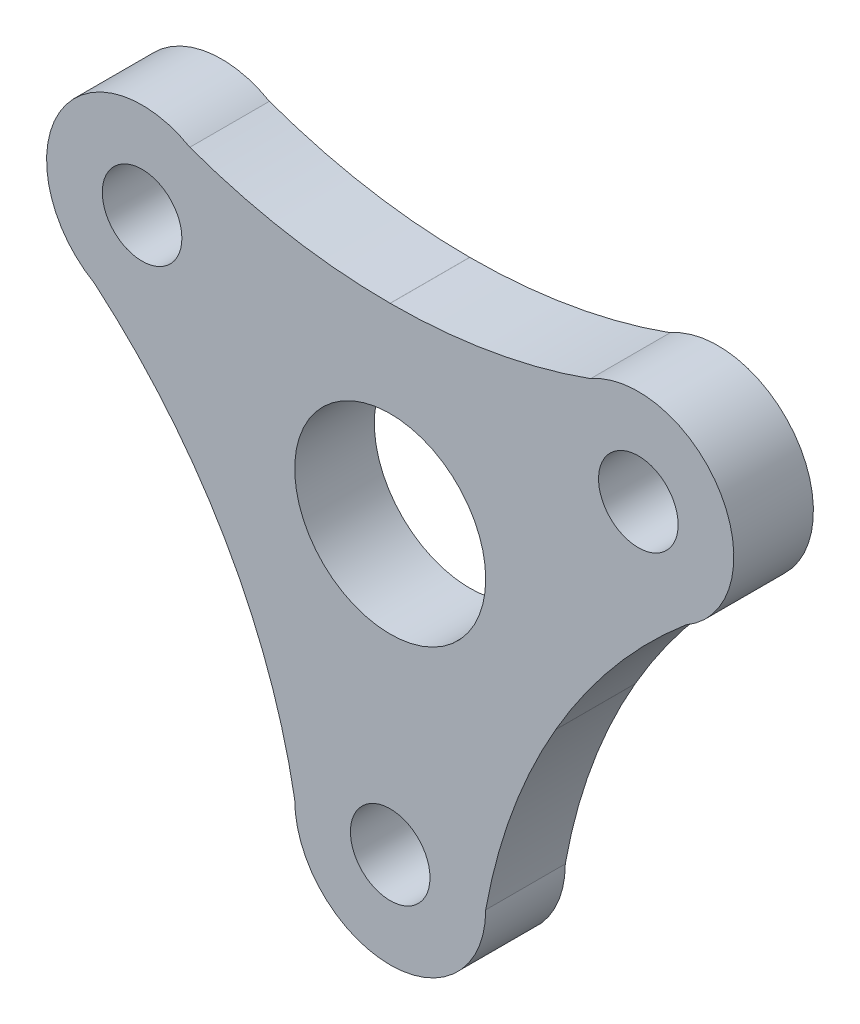
ISO-10303-21;
HEADER;
FILE_DESCRIPTION(('STEP AP214'),'2;1');
FILE_NAME('part.step','',(''),(''),'','','');
FILE_SCHEMA(('AUTOMOTIVE_DESIGN { 1 0 10303 214 1 1 1 1 }'));
ENDSEC;
DATA;
#1=APPLICATION_CONTEXT('core data for automotive mechanical design processes');
#2=APPLICATION_PROTOCOL_DEFINITION('international standard','automotive_design',2000,#1);
#3=PRODUCT_CONTEXT('',#1,'mechanical');
#4=PRODUCT('Part','Part','',(#3));
#5=PRODUCT_RELATED_PRODUCT_CATEGORY('part','',(#4));
#6=PRODUCT_DEFINITION_FORMATION('','',#4);
#7=PRODUCT_DEFINITION_CONTEXT('part definition',#1,'design');
#8=PRODUCT_DEFINITION('design','',#6,#7);
#9=PRODUCT_DEFINITION_SHAPE('','',#8);
#10=(LENGTH_UNIT() NAMED_UNIT(*) SI_UNIT(.MILLI.,.METRE.));
#11=(NAMED_UNIT(*) PLANE_ANGLE_UNIT() SI_UNIT($,.RADIAN.));
#12=(NAMED_UNIT(*) SI_UNIT($,.STERADIAN.) SOLID_ANGLE_UNIT());
#13=UNCERTAINTY_MEASURE_WITH_UNIT(LENGTH_MEASURE(1.E-05),#10,'distance_accuracy_value','');
#14=(GEOMETRIC_REPRESENTATION_CONTEXT(3) GLOBAL_UNCERTAINTY_ASSIGNED_CONTEXT((#13)) GLOBAL_UNIT_ASSIGNED_CONTEXT((#10,
#11,#12)) REPRESENTATION_CONTEXT('',''));
#15=CARTESIAN_POINT('',(0.,0.,0.));
#16=DIRECTION('',(0.,0.,1.));
#17=DIRECTION('',(1.,0.,0.));
#18=AXIS2_PLACEMENT_3D('',#15,#16,#17);
#19=CARTESIAN_POINT('',(4.90552812808803,9.99999999999493,5.));
#20=DIRECTION('',(0.,0.,1.));
#21=DIRECTION('',(1.,0.,0.));
#22=AXIS2_PLACEMENT_3D('',#19,#20,#21);
#23=PLANE('',#22);
#24=CARTESIAN_POINT('',(4.90552812808803,9.99999999999493,5.));
#25=DIRECTION('',(0.,0.,1.));
#26=DIRECTION('',(1.,0.,0.));
#27=AXIS2_PLACEMENT_3D('',#24,#25,#26);
#28=CIRCLE('',#27,6.);
#29=CARTESIAN_POINT('',(10.905528128088,9.99999999999493,5.));
#30=VERTEX_POINT('',#29);
#31=EDGE_CURVE('E377',#30,#30,#28,.T.);
#32=ORIENTED_EDGE('',*,*,#31,.F.);
#33=EDGE_LOOP('',(#32));
#34=FACE_BOUND('',#33,.T.);
#35=CARTESIAN_POINT('',(20.493985396208,18.9999999999951,5.));
#36=DIRECTION('',(0.,0.,1.));
#37=DIRECTION('',(1.,0.,0.));
#38=AXIS2_PLACEMENT_3D('',#35,#36,#37);
#39=CIRCLE('',#38,2.5);
#40=CARTESIAN_POINT('',(22.993985396208,18.9999999999951,5.));
#41=VERTEX_POINT('',#40);
#42=EDGE_CURVE('E366',#41,#41,#39,.T.);
#43=ORIENTED_EDGE('',*,*,#42,.F.);
#44=EDGE_LOOP('',(#43));
#45=FACE_BOUND('',#44,.T.);
#46=CARTESIAN_POINT('',(4.90552812808851,-8.00000000000507,5.));
#47=DIRECTION('',(0.,0.,1.));
#48=DIRECTION('',(1.,0.,0.));
#49=AXIS2_PLACEMENT_3D('',#46,#47,#48);
#50=CIRCLE('',#49,2.5);
#51=CARTESIAN_POINT('',(7.40552812808851,-8.00000000000507,5.));
#52=VERTEX_POINT('',#51);
#53=EDGE_CURVE('E357',#52,#52,#50,.T.);
#54=ORIENTED_EDGE('',*,*,#53,.F.);
#55=EDGE_LOOP('',(#54));
#56=FACE_BOUND('',#55,.T.);
#57=CARTESIAN_POINT('',(-10.6829291400317,18.9999999999947,5.));
#58=DIRECTION('',(0.,0.,1.));
#59=DIRECTION('',(1.,0.,0.));
#60=AXIS2_PLACEMENT_3D('',#57,#58,#59);
#61=CIRCLE('',#60,2.5);
#62=CARTESIAN_POINT('',(-8.18292914003175,18.9999999999947,5.));
#63=VERTEX_POINT('',#62);
#64=EDGE_CURVE('E352',#63,#63,#61,.T.);
#65=ORIENTED_EDGE('',*,*,#64,.F.);
#66=EDGE_LOOP('',(#65));
#67=FACE_BOUND('',#66,.T.);
#68=CARTESIAN_POINT('',(47.3561949320903,-14.4732625308125,5.));
#69=DIRECTION('',(0.,0.,1.));
#70=DIRECTION('',(1.,0.,0.));
#71=AXIS2_PLACEMENT_3D('',#68,#69,#70);
#72=CIRCLE('',#71,37.);
#73=CARTESIAN_POINT('',(23.4939853962091,13.8038475772891,5.));
#74=VERTEX_POINT('',#73);
#75=CARTESIAN_POINT('',(15.3016097943742,4.006547951634,5.));
#76=VERTEX_POINT('',#75);
#77=EDGE_CURVE('E273',#74,#76,#72,.T.);
#78=ORIENTED_EDGE('',*,*,#77,.F.);
#79=CARTESIAN_POINT('',(20.493985396208,18.9999999999951,5.));
#80=DIRECTION('',(0.,0.,1.));
#81=DIRECTION('',(1.,0.,0.));
#82=AXIS2_PLACEMENT_3D('',#79,#80,#81);
#83=CIRCLE('',#82,6.);
#84=CARTESIAN_POINT('',(17.4939853962074,24.1961524227014,5.));
#85=VERTEX_POINT('',#84);
#86=EDGE_CURVE('E319',#74,#85,#83,.T.);
#87=ORIENTED_EDGE('',*,*,#86,.T.);
#88=CARTESIAN_POINT('',(4.93639446492297,58.9999871252528,5.));
#89=DIRECTION('',(0.,0.,1.));
#90=DIRECTION('',(1.,0.,0.));
#91=AXIS2_PLACEMENT_3D('',#88,#89,#90);
#92=CIRCLE('',#91,37.);
#93=CARTESIAN_POINT('',(4.90552812808849,21.9999999999947,5.));
#94=VERTEX_POINT('',#93);
#95=EDGE_CURVE('E315',#85,#94,#92,.F.);
#96=ORIENTED_EDGE('',*,*,#95,.T.);
#97=CARTESIAN_POINT('',(4.90552812808803,9.99999999999493,5.));
#98=DIRECTION('',(0.,0.,1.));
#99=DIRECTION('',(1.,0.,0.));
#100=AXIS2_PLACEMENT_3D('',#97,#98,#99);
#101=CIRCLE('',#100,11.9999999999998);
#102=CARTESIAN_POINT('',(4.89796902518955,21.9999968469967,5.));
#103=VERTEX_POINT('',#102);
#104=EDGE_CURVE('E330',#94,#103,#101,.T.);
#105=ORIENTED_EDGE('',*,*,#104,.T.);
#106=CARTESIAN_POINT('',(4.87466179125256,58.9999871252528,5.));
#107=DIRECTION('',(0.,0.,1.));
#108=DIRECTION('',(1.,0.,0.));
#109=AXIS2_PLACEMENT_3D('',#106,#107,#108);
#110=CIRCLE('',#109,37.);
#111=CARTESIAN_POINT('',(-7.68292914003176,24.1961524227014,5.));
#112=VERTEX_POINT('',#111);
#113=EDGE_CURVE('E326',#112,#103,#110,.T.);
#114=ORIENTED_EDGE('',*,*,#113,.F.);
#115=CARTESIAN_POINT('',(-10.6829291400317,18.9999999999947,5.));
#116=DIRECTION('',(0.,0.,1.));
#117=DIRECTION('',(1.,0.,0.));
#118=AXIS2_PLACEMENT_3D('',#115,#116,#117);
#119=CIRCLE('',#118,6.);
#120=CARTESIAN_POINT('',(-13.6829291400317,13.803847577288,5.));
#121=VERTEX_POINT('',#120);
#122=EDGE_CURVE('E323',#112,#121,#119,.T.);
#123=ORIENTED_EDGE('',*,*,#122,.T.);
#124=CARTESIAN_POINT('',(-37.5451386759127,-14.4732625308137,5.));
#125=DIRECTION('',(0.,0.,1.));
#126=DIRECTION('',(1.,0.,0.));
#127=AXIS2_PLACEMENT_3D('',#124,#125,#126);
#128=CIRCLE('',#127,37.);
#129=CARTESIAN_POINT('',(-5.49055353819772,4.00654795163371,5.));
#130=VERTEX_POINT('',#129);
#131=EDGE_CURVE('E296',#121,#130,#128,.F.);
#132=ORIENTED_EDGE('',*,*,#131,.T.);
#133=CARTESIAN_POINT('',(4.90552812808803,9.99999999999493,5.));
#134=DIRECTION('',(0.,0.,1.));
#135=DIRECTION('',(1.,0.,0.));
#136=AXIS2_PLACEMENT_3D('',#133,#134,#135);
#137=CIRCLE('',#136,11.9999999999998);
#138=CARTESIAN_POINT('',(-5.48677671732493,3.99999999999483,5.));
#139=VERTEX_POINT('',#138);
#140=EDGE_CURVE('E293',#130,#139,#137,.T.);
#141=ORIENTED_EDGE('',*,*,#140,.T.);
#142=CARTESIAN_POINT('',(-37.5142723390775,-14.5267245944558,5.));
#143=DIRECTION('',(0.,0.,1.));
#144=DIRECTION('',(1.,0.,0.));
#145=AXIS2_PLACEMENT_3D('',#142,#143,#144);
#146=CIRCLE('',#145,37.);
#147=CARTESIAN_POINT('',(-1.09447187191149,-8.00000000000433,5.));
#148=VERTEX_POINT('',#147);
#149=EDGE_CURVE('E252',#148,#139,#146,.T.);
#150=ORIENTED_EDGE('',*,*,#149,.F.);
#151=CARTESIAN_POINT('',(4.90552812808851,-8.00000000000507,5.));
#152=DIRECTION('',(0.,0.,1.));
#153=DIRECTION('',(1.,0.,0.));
#154=AXIS2_PLACEMENT_3D('',#151,#152,#153);
#155=CIRCLE('',#154,6.);
#156=CARTESIAN_POINT('',(10.9055281280885,-8.00000000000641,5.));
#157=VERTEX_POINT('',#156);
#158=EDGE_CURVE('E244',#148,#157,#155,.T.);
#159=ORIENTED_EDGE('',*,*,#158,.T.);
#160=CARTESIAN_POINT('',(47.325328595255,-14.5267245944547,5.));
#161=DIRECTION('',(0.,0.,1.));
#162=DIRECTION('',(1.,0.,0.));
#163=AXIS2_PLACEMENT_3D('',#160,#161,#162);
#164=CIRCLE('',#163,37.);
#165=CARTESIAN_POINT('',(15.2978329735011,3.99999999999509,5.));
#166=VERTEX_POINT('',#165);
#167=EDGE_CURVE('E249',#157,#166,#164,.F.);
#168=ORIENTED_EDGE('',*,*,#167,.T.);
#169=CARTESIAN_POINT('',(4.90552812808803,9.99999999999493,5.));
#170=DIRECTION('',(0.,0.,1.));
#171=DIRECTION('',(1.,0.,0.));
#172=AXIS2_PLACEMENT_3D('',#169,#170,#171);
#173=CIRCLE('',#172,11.9999999999998);
#174=EDGE_CURVE('E267',#166,#76,#173,.T.);
#175=ORIENTED_EDGE('',*,*,#174,.T.);
#176=EDGE_LOOP('',(#78,#87,#96,#105,#114,#123,#132,#141,#150,#159,#168,#175));
#177=FACE_BOUND('',#176,.T.);
#178=ADVANCED_FACE('F152',(#34,#45,#56,#67,#177),#23,.T.);
#179=CARTESIAN_POINT('',(4.90552812808803,9.99999999999493,0.));
#180=DIRECTION('',(0.,0.,1.));
#181=DIRECTION('',(1.,0.,0.));
#182=AXIS2_PLACEMENT_3D('',#179,#180,#181);
#183=PLANE('',#182);
#184=CARTESIAN_POINT('',(4.90552812808803,9.99999999999493,0.));
#185=DIRECTION('',(0.,0.,1.));
#186=DIRECTION('',(1.,0.,0.));
#187=AXIS2_PLACEMENT_3D('',#184,#185,#186);
#188=CIRCLE('',#187,6.);
#189=CARTESIAN_POINT('',(10.905528128088,9.99999999999493,0.));
#190=VERTEX_POINT('',#189);
#191=EDGE_CURVE('E365',#190,#190,#188,.T.);
#192=ORIENTED_EDGE('',*,*,#191,.T.);
#193=EDGE_LOOP('',(#192));
#194=FACE_BOUND('',#193,.T.);
#195=CARTESIAN_POINT('',(20.493985396208,18.9999999999951,0.));
#196=DIRECTION('',(0.,0.,1.));
#197=DIRECTION('',(1.,0.,0.));
#198=AXIS2_PLACEMENT_3D('',#195,#196,#197);
#199=CIRCLE('',#198,2.5);
#200=CARTESIAN_POINT('',(22.993985396208,18.9999999999951,0.));
#201=VERTEX_POINT('',#200);
#202=EDGE_CURVE('E361',#201,#201,#199,.T.);
#203=ORIENTED_EDGE('',*,*,#202,.T.);
#204=EDGE_LOOP('',(#203));
#205=FACE_BOUND('',#204,.T.);
#206=CARTESIAN_POINT('',(4.90552812808851,-8.00000000000507,0.));
#207=DIRECTION('',(0.,0.,1.));
#208=DIRECTION('',(1.,0.,0.));
#209=AXIS2_PLACEMENT_3D('',#206,#207,#208);
#210=CIRCLE('',#209,2.5);
#211=CARTESIAN_POINT('',(7.40552812808851,-8.00000000000507,0.));
#212=VERTEX_POINT('',#211);
#213=EDGE_CURVE('E370',#212,#212,#210,.T.);
#214=ORIENTED_EDGE('',*,*,#213,.T.);
#215=EDGE_LOOP('',(#214));
#216=FACE_BOUND('',#215,.T.);
#217=CARTESIAN_POINT('',(-10.6829291400317,18.9999999999947,0.));
#218=DIRECTION('',(0.,0.,1.));
#219=DIRECTION('',(1.,0.,0.));
#220=AXIS2_PLACEMENT_3D('',#217,#218,#219);
#221=CIRCLE('',#220,2.5);
#222=CARTESIAN_POINT('',(-8.18292914003175,18.9999999999947,0.));
#223=VERTEX_POINT('',#222);
#224=EDGE_CURVE('E353',#223,#223,#221,.T.);
#225=ORIENTED_EDGE('',*,*,#224,.T.);
#226=EDGE_LOOP('',(#225));
#227=FACE_BOUND('',#226,.T.);
#228=CARTESIAN_POINT('',(20.493985396208,18.9999999999951,0.));
#229=DIRECTION('',(0.,0.,1.));
#230=DIRECTION('',(1.,0.,0.));
#231=AXIS2_PLACEMENT_3D('',#228,#229,#230);
#232=CIRCLE('',#231,6.);
#233=CARTESIAN_POINT('',(23.4939853962091,13.8038475772891,0.));
#234=VERTEX_POINT('',#233);
#235=CARTESIAN_POINT('',(17.4939853962074,24.1961524227014,0.));
#236=VERTEX_POINT('',#235);
#237=EDGE_CURVE('E338',#234,#236,#232,.T.);
#238=ORIENTED_EDGE('',*,*,#237,.F.);
#239=CARTESIAN_POINT('',(47.3561949320903,-14.4732625308125,0.));
#240=DIRECTION('',(0.,0.,1.));
#241=DIRECTION('',(1.,0.,0.));
#242=AXIS2_PLACEMENT_3D('',#239,#240,#241);
#243=CIRCLE('',#242,37.);
#244=CARTESIAN_POINT('',(15.3016097943742,4.006547951634,0.));
#245=VERTEX_POINT('',#244);
#246=EDGE_CURVE('E12',#234,#245,#243,.T.);
#247=ORIENTED_EDGE('',*,*,#246,.T.);
#248=CARTESIAN_POINT('',(4.90552812808803,9.99999999999493,0.));
#249=DIRECTION('',(0.,0.,1.));
#250=DIRECTION('',(1.,0.,0.));
#251=AXIS2_PLACEMENT_3D('',#248,#249,#250);
#252=CIRCLE('',#251,11.9999999999998);
#253=CARTESIAN_POINT('',(15.2978329735011,3.99999999999509,0.));
#254=VERTEX_POINT('',#253);
#255=EDGE_CURVE('E161',#254,#245,#252,.T.);
#256=ORIENTED_EDGE('',*,*,#255,.F.);
#257=CARTESIAN_POINT('',(47.325328595255,-14.5267245944547,0.));
#258=DIRECTION('',(0.,0.,1.));
#259=DIRECTION('',(1.,0.,0.));
#260=AXIS2_PLACEMENT_3D('',#257,#258,#259);
#261=CIRCLE('',#260,37.);
#262=CARTESIAN_POINT('',(10.9055281280885,-8.00000000000641,0.));
#263=VERTEX_POINT('',#262);
#264=EDGE_CURVE('E401',#263,#254,#261,.F.);
#265=ORIENTED_EDGE('',*,*,#264,.F.);
#266=CARTESIAN_POINT('',(4.90552812808851,-8.00000000000507,0.));
#267=DIRECTION('',(0.,0.,1.));
#268=DIRECTION('',(1.,0.,0.));
#269=AXIS2_PLACEMENT_3D('',#266,#267,#268);
#270=CIRCLE('',#269,6.);
#271=CARTESIAN_POINT('',(-1.09447187191149,-8.00000000000433,0.));
#272=VERTEX_POINT('',#271);
#273=EDGE_CURVE('E262',#272,#263,#270,.T.);
#274=ORIENTED_EDGE('',*,*,#273,.F.);
#275=CARTESIAN_POINT('',(-37.5142723390775,-14.5267245944558,0.));
#276=DIRECTION('',(0.,0.,1.));
#277=DIRECTION('',(1.,0.,0.));
#278=AXIS2_PLACEMENT_3D('',#275,#276,#277);
#279=CIRCLE('',#278,37.);
#280=CARTESIAN_POINT('',(-5.48677671732493,3.99999999999483,0.));
#281=VERTEX_POINT('',#280);
#282=EDGE_CURVE('E392',#272,#281,#279,.T.);
#283=ORIENTED_EDGE('',*,*,#282,.T.);
#284=CARTESIAN_POINT('',(4.90552812808803,9.99999999999493,0.));
#285=DIRECTION('',(0.,0.,1.));
#286=DIRECTION('',(1.,0.,0.));
#287=AXIS2_PLACEMENT_3D('',#284,#285,#286);
#288=CIRCLE('',#287,11.9999999999998);
#289=CARTESIAN_POINT('',(-5.49055353819772,4.00654795163371,0.));
#290=VERTEX_POINT('',#289);
#291=EDGE_CURVE('E396',#290,#281,#288,.T.);
#292=ORIENTED_EDGE('',*,*,#291,.F.);
#293=CARTESIAN_POINT('',(-37.5451386759127,-14.4732625308137,0.));
#294=DIRECTION('',(0.,0.,1.));
#295=DIRECTION('',(1.,0.,0.));
#296=AXIS2_PLACEMENT_3D('',#293,#294,#295);
#297=CIRCLE('',#296,37.);
#298=CARTESIAN_POINT('',(-13.6829291400317,13.803847577288,0.));
#299=VERTEX_POINT('',#298);
#300=EDGE_CURVE('E399',#299,#290,#297,.F.);
#301=ORIENTED_EDGE('',*,*,#300,.F.);
#302=CARTESIAN_POINT('',(-10.6829291400317,18.9999999999947,0.));
#303=DIRECTION('',(0.,0.,1.));
#304=DIRECTION('',(1.,0.,0.));
#305=AXIS2_PLACEMENT_3D('',#302,#303,#304);
#306=CIRCLE('',#305,6.);
#307=CARTESIAN_POINT('',(-7.68292914003176,24.1961524227014,0.));
#308=VERTEX_POINT('',#307);
#309=EDGE_CURVE('E349',#308,#299,#306,.T.);
#310=ORIENTED_EDGE('',*,*,#309,.F.);
#311=CARTESIAN_POINT('',(4.87466179125256,58.9999871252528,0.));
#312=DIRECTION('',(0.,0.,1.));
#313=DIRECTION('',(1.,0.,0.));
#314=AXIS2_PLACEMENT_3D('',#311,#312,#313);
#315=CIRCLE('',#314,37.);
#316=CARTESIAN_POINT('',(4.89796902518955,21.9999968469967,0.));
#317=VERTEX_POINT('',#316);
#318=EDGE_CURVE('E388',#308,#317,#315,.T.);
#319=ORIENTED_EDGE('',*,*,#318,.T.);
#320=CARTESIAN_POINT('',(4.90552812808803,9.99999999999493,0.));
#321=DIRECTION('',(0.,0.,1.));
#322=DIRECTION('',(1.,0.,0.));
#323=AXIS2_PLACEMENT_3D('',#320,#321,#322);
#324=CIRCLE('',#323,11.9999999999998);
#325=CARTESIAN_POINT('',(4.90552812808849,21.9999999999947,0.));
#326=VERTEX_POINT('',#325);
#327=EDGE_CURVE('E175',#326,#317,#324,.T.);
#328=ORIENTED_EDGE('',*,*,#327,.F.);
#329=CARTESIAN_POINT('',(4.93639446492297,58.9999871252528,0.));
#330=DIRECTION('',(0.,0.,1.));
#331=DIRECTION('',(1.,0.,0.));
#332=AXIS2_PLACEMENT_3D('',#329,#330,#331);
#333=CIRCLE('',#332,37.);
#334=EDGE_CURVE('E168',#236,#326,#333,.F.);
#335=ORIENTED_EDGE('',*,*,#334,.F.);
#336=EDGE_LOOP('',(#238,#247,#256,#265,#274,#283,#292,#301,#310,#319,#328,#335));
#337=FACE_BOUND('',#336,.T.);
#338=ADVANCED_FACE('F154',(#194,#205,#216,#227,#337),#183,.F.);
#339=CARTESIAN_POINT('',(4.90552812808803,9.99999999999493,5.));
#340=DIRECTION('',(0.,0.,-1.));
#341=DIRECTION('',(-1.,0.,0.));
#342=AXIS2_PLACEMENT_3D('',#339,#340,#341);
#343=CYLINDRICAL_SURFACE('',#342,6.);
#344=ORIENTED_EDGE('',*,*,#31,.T.);
#345=EDGE_LOOP('',(#344));
#346=FACE_BOUND('',#345,.T.);
#347=ORIENTED_EDGE('',*,*,#191,.F.);
#348=EDGE_LOOP('',(#347));
#349=FACE_BOUND('',#348,.T.);
#350=ADVANCED_FACE('F454',(#346,#349),#343,.F.);
#351=CARTESIAN_POINT('',(20.493985396208,18.9999999999951,0.));
#352=DIRECTION('',(0.,0.,1.));
#353=DIRECTION('',(1.,0.,0.));
#354=AXIS2_PLACEMENT_3D('',#351,#352,#353);
#355=CYLINDRICAL_SURFACE('',#354,2.5);
#356=ORIENTED_EDGE('',*,*,#202,.F.);
#357=EDGE_LOOP('',(#356));
#358=FACE_BOUND('',#357,.T.);
#359=ORIENTED_EDGE('',*,*,#42,.T.);
#360=EDGE_LOOP('',(#359));
#361=FACE_BOUND('',#360,.T.);
#362=ADVANCED_FACE('F461',(#358,#361),#355,.F.);
#363=CARTESIAN_POINT('',(4.90552812808851,-8.00000000000507,0.));
#364=DIRECTION('',(0.,0.,1.));
#365=DIRECTION('',(1.,0.,0.));
#366=AXIS2_PLACEMENT_3D('',#363,#364,#365);
#367=CYLINDRICAL_SURFACE('',#366,2.5);
#368=ORIENTED_EDGE('',*,*,#213,.F.);
#369=EDGE_LOOP('',(#368));
#370=FACE_BOUND('',#369,.T.);
#371=ORIENTED_EDGE('',*,*,#53,.T.);
#372=EDGE_LOOP('',(#371));
#373=FACE_BOUND('',#372,.T.);
#374=ADVANCED_FACE('F463',(#370,#373),#367,.F.);
#375=CARTESIAN_POINT('',(-10.6829291400317,18.9999999999947,0.));
#376=DIRECTION('',(0.,0.,1.));
#377=DIRECTION('',(1.,0.,0.));
#378=AXIS2_PLACEMENT_3D('',#375,#376,#377);
#379=CYLINDRICAL_SURFACE('',#378,2.5);
#380=ORIENTED_EDGE('',*,*,#224,.F.);
#381=EDGE_LOOP('',(#380));
#382=FACE_BOUND('',#381,.T.);
#383=ORIENTED_EDGE('',*,*,#64,.T.);
#384=EDGE_LOOP('',(#383));
#385=FACE_BOUND('',#384,.T.);
#386=ADVANCED_FACE('F466',(#382,#385),#379,.F.);
#387=CARTESIAN_POINT('',(4.93639446492297,58.9999871252528,-5.));
#388=DIRECTION('',(0.,0.,1.));
#389=DIRECTION('',(1.,0.,0.));
#390=AXIS2_PLACEMENT_3D('',#387,#388,#389);
#391=CYLINDRICAL_SURFACE('',#390,37.);
#392=ORIENTED_EDGE('',*,*,#334,.T.);
#393=DIRECTION('',(0.,0.,1.));
#394=VECTOR('',#393,1.);
#395=CARTESIAN_POINT('',(4.90552812808849,21.9999999999947,-5.));
#396=LINE('',#395,#394);
#397=EDGE_CURVE('E335',#326,#94,#396,.T.);
#398=ORIENTED_EDGE('',*,*,#397,.T.);
#399=ORIENTED_EDGE('',*,*,#95,.F.);
#400=DIRECTION('',(0.,0.,1.));
#401=VECTOR('',#400,1.);
#402=CARTESIAN_POINT('',(17.4939853962074,24.1961524227014,-5.));
#403=LINE('',#402,#401);
#404=EDGE_CURVE('E334',#236,#85,#403,.T.);
#405=ORIENTED_EDGE('',*,*,#404,.F.);
#406=EDGE_LOOP('',(#392,#398,#399,#405));
#407=FACE_BOUND('',#406,.T.);
#408=ADVANCED_FACE('F417',(#407),#391,.F.);
#409=CARTESIAN_POINT('',(4.90552812808803,9.99999999999493,-5.));
#410=DIRECTION('',(0.,0.,1.));
#411=DIRECTION('',(1.,0.,0.));
#412=AXIS2_PLACEMENT_3D('',#409,#410,#411);
#413=CYLINDRICAL_SURFACE('',#412,11.9999999999998);
#414=ORIENTED_EDGE('',*,*,#327,.T.);
#415=DIRECTION('',(0.,0.,1.));
#416=VECTOR('',#415,1.);
#417=CARTESIAN_POINT('',(4.89796902518955,21.9999968469967,-5.));
#418=LINE('',#417,#416);
#419=EDGE_CURVE('E339',#317,#103,#418,.T.);
#420=ORIENTED_EDGE('',*,*,#419,.T.);
#421=ORIENTED_EDGE('',*,*,#104,.F.);
#422=ORIENTED_EDGE('',*,*,#397,.F.);
#423=EDGE_LOOP('',(#414,#420,#421,#422));
#424=FACE_BOUND('',#423,.T.);
#425=ADVANCED_FACE('F420',(#424),#413,.T.);
#426=CARTESIAN_POINT('',(4.87466179125256,58.9999871252528,-5.));
#427=DIRECTION('',(0.,0.,1.));
#428=DIRECTION('',(1.,0.,0.));
#429=AXIS2_PLACEMENT_3D('',#426,#427,#428);
#430=CYLINDRICAL_SURFACE('',#429,37.);
#431=DIRECTION('',(0.,0.,1.));
#432=VECTOR('',#431,1.);
#433=CARTESIAN_POINT('',(-7.68292914003176,24.1961524227014,-5.));
#434=LINE('',#433,#432);
#435=EDGE_CURVE('E342',#308,#112,#434,.T.);
#436=ORIENTED_EDGE('',*,*,#435,.T.);
#437=ORIENTED_EDGE('',*,*,#113,.T.);
#438=ORIENTED_EDGE('',*,*,#419,.F.);
#439=ORIENTED_EDGE('',*,*,#318,.F.);
#440=EDGE_LOOP('',(#436,#437,#438,#439));
#441=FACE_BOUND('',#440,.T.);
#442=ADVANCED_FACE('F422',(#441),#430,.F.);
#443=CARTESIAN_POINT('',(-10.6829291400317,18.9999999999947,-5.));
#444=DIRECTION('',(0.,0.,1.));
#445=DIRECTION('',(1.,0.,0.));
#446=AXIS2_PLACEMENT_3D('',#443,#444,#445);
#447=CYLINDRICAL_SURFACE('',#446,6.);
#448=ORIENTED_EDGE('',*,*,#309,.T.);
#449=DIRECTION('',(0.,0.,1.));
#450=VECTOR('',#449,1.);
#451=CARTESIAN_POINT('',(-13.6829291400317,13.803847577288,-5.));
#452=LINE('',#451,#450);
#453=EDGE_CURVE('E301',#299,#121,#452,.T.);
#454=ORIENTED_EDGE('',*,*,#453,.T.);
#455=ORIENTED_EDGE('',*,*,#122,.F.);
#456=ORIENTED_EDGE('',*,*,#435,.F.);
#457=EDGE_LOOP('',(#448,#454,#455,#456));
#458=FACE_BOUND('',#457,.T.);
#459=ADVANCED_FACE('F427',(#458),#447,.T.);
#460=CARTESIAN_POINT('',(20.493985396208,18.9999999999951,-5.));
#461=DIRECTION('',(0.,0.,1.));
#462=DIRECTION('',(1.,0.,0.));
#463=AXIS2_PLACEMENT_3D('',#460,#461,#462);
#464=CYLINDRICAL_SURFACE('',#463,6.);
#465=ORIENTED_EDGE('',*,*,#237,.T.);
#466=ORIENTED_EDGE('',*,*,#404,.T.);
#467=ORIENTED_EDGE('',*,*,#86,.F.);
#468=DIRECTION('',(0.,0.,1.));
#469=VECTOR('',#468,1.);
#470=CARTESIAN_POINT('',(23.4939853962091,13.8038475772891,-5.));
#471=LINE('',#470,#469);
#472=EDGE_CURVE('E266',#234,#74,#471,.T.);
#473=ORIENTED_EDGE('',*,*,#472,.F.);
#474=EDGE_LOOP('',(#465,#466,#467,#473));
#475=FACE_BOUND('',#474,.T.);
#476=ADVANCED_FACE('F415',(#475),#464,.T.);
#477=CARTESIAN_POINT('',(-37.5451386759127,-14.4732625308137,-5.));
#478=DIRECTION('',(0.,0.,1.));
#479=DIRECTION('',(1.,0.,0.));
#480=AXIS2_PLACEMENT_3D('',#477,#478,#479);
#481=CYLINDRICAL_SURFACE('',#480,37.);
#482=ORIENTED_EDGE('',*,*,#300,.T.);
#483=DIRECTION('',(0.,0.,1.));
#484=VECTOR('',#483,1.);
#485=CARTESIAN_POINT('',(-5.49055353819772,4.00654795163371,-5.));
#486=LINE('',#485,#484);
#487=EDGE_CURVE('E305',#290,#130,#486,.T.);
#488=ORIENTED_EDGE('',*,*,#487,.T.);
#489=ORIENTED_EDGE('',*,*,#131,.F.);
#490=ORIENTED_EDGE('',*,*,#453,.F.);
#491=EDGE_LOOP('',(#482,#488,#489,#490));
#492=FACE_BOUND('',#491,.T.);
#493=ADVANCED_FACE('F432',(#492),#481,.F.);
#494=CARTESIAN_POINT('',(4.90552812808803,9.99999999999493,-5.));
#495=DIRECTION('',(0.,0.,1.));
#496=DIRECTION('',(1.,0.,0.));
#497=AXIS2_PLACEMENT_3D('',#494,#495,#496);
#498=CYLINDRICAL_SURFACE('',#497,11.9999999999998);
#499=ORIENTED_EDGE('',*,*,#291,.T.);
#500=DIRECTION('',(0.,0.,1.));
#501=VECTOR('',#500,1.);
#502=CARTESIAN_POINT('',(-5.48677671732493,3.99999999999483,-5.));
#503=LINE('',#502,#501);
#504=EDGE_CURVE('E308',#281,#139,#503,.T.);
#505=ORIENTED_EDGE('',*,*,#504,.T.);
#506=ORIENTED_EDGE('',*,*,#140,.F.);
#507=ORIENTED_EDGE('',*,*,#487,.F.);
#508=EDGE_LOOP('',(#499,#505,#506,#507));
#509=FACE_BOUND('',#508,.T.);
#510=ADVANCED_FACE('F437',(#509),#498,.T.);
#511=CARTESIAN_POINT('',(-37.5142723390775,-14.5267245944558,-5.));
#512=DIRECTION('',(0.,0.,1.));
#513=DIRECTION('',(1.,0.,0.));
#514=AXIS2_PLACEMENT_3D('',#511,#512,#513);
#515=CYLINDRICAL_SURFACE('',#514,37.);
#516=DIRECTION('',(0.,0.,1.));
#517=VECTOR('',#516,1.);
#518=CARTESIAN_POINT('',(-1.09447187191149,-8.00000000000433,-5.));
#519=LINE('',#518,#517);
#520=EDGE_CURVE('E300',#272,#148,#519,.T.);
#521=ORIENTED_EDGE('',*,*,#520,.T.);
#522=ORIENTED_EDGE('',*,*,#149,.T.);
#523=ORIENTED_EDGE('',*,*,#504,.F.);
#524=ORIENTED_EDGE('',*,*,#282,.F.);
#525=EDGE_LOOP('',(#521,#522,#523,#524));
#526=FACE_BOUND('',#525,.T.);
#527=ADVANCED_FACE('F440',(#526),#515,.F.);
#528=CARTESIAN_POINT('',(4.90552812808851,-8.00000000000507,-5.));
#529=DIRECTION('',(0.,0.,1.));
#530=DIRECTION('',(1.,0.,0.));
#531=AXIS2_PLACEMENT_3D('',#528,#529,#530);
#532=CYLINDRICAL_SURFACE('',#531,6.);
#533=ORIENTED_EDGE('',*,*,#273,.T.);
#534=DIRECTION('',(0.,0.,1.));
#535=VECTOR('',#534,1.);
#536=CARTESIAN_POINT('',(10.9055281280885,-8.00000000000641,-5.));
#537=LINE('',#536,#535);
#538=EDGE_CURVE('E259',#263,#157,#537,.T.);
#539=ORIENTED_EDGE('',*,*,#538,.T.);
#540=ORIENTED_EDGE('',*,*,#158,.F.);
#541=ORIENTED_EDGE('',*,*,#520,.F.);
#542=EDGE_LOOP('',(#533,#539,#540,#541));
#543=FACE_BOUND('',#542,.T.);
#544=ADVANCED_FACE('F260',(#543),#532,.T.);
#545=CARTESIAN_POINT('',(47.325328595255,-14.5267245944547,-5.));
#546=DIRECTION('',(0.,0.,1.));
#547=DIRECTION('',(1.,0.,0.));
#548=AXIS2_PLACEMENT_3D('',#545,#546,#547);
#549=CYLINDRICAL_SURFACE('',#548,37.);
#550=ORIENTED_EDGE('',*,*,#264,.T.);
#551=DIRECTION('',(0.,0.,1.));
#552=VECTOR('',#551,1.);
#553=CARTESIAN_POINT('',(15.2978329735011,3.99999999999509,-5.));
#554=LINE('',#553,#552);
#555=EDGE_CURVE('E256',#254,#166,#554,.T.);
#556=ORIENTED_EDGE('',*,*,#555,.T.);
#557=ORIENTED_EDGE('',*,*,#167,.F.);
#558=ORIENTED_EDGE('',*,*,#538,.F.);
#559=EDGE_LOOP('',(#550,#556,#557,#558));
#560=FACE_BOUND('',#559,.T.);
#561=ADVANCED_FACE('F269',(#560),#549,.F.);
#562=CARTESIAN_POINT('',(4.90552812808803,9.99999999999493,-5.));
#563=DIRECTION('',(0.,0.,1.));
#564=DIRECTION('',(1.,0.,0.));
#565=AXIS2_PLACEMENT_3D('',#562,#563,#564);
#566=CYLINDRICAL_SURFACE('',#565,11.9999999999998);
#567=ORIENTED_EDGE('',*,*,#255,.T.);
#568=DIRECTION('',(0.,0.,1.));
#569=VECTOR('',#568,1.);
#570=CARTESIAN_POINT('',(15.3016097943742,4.006547951634,-5.));
#571=LINE('',#570,#569);
#572=EDGE_CURVE('E285',#245,#76,#571,.T.);
#573=ORIENTED_EDGE('',*,*,#572,.T.);
#574=ORIENTED_EDGE('',*,*,#174,.F.);
#575=ORIENTED_EDGE('',*,*,#555,.F.);
#576=EDGE_LOOP('',(#567,#573,#574,#575));
#577=FACE_BOUND('',#576,.T.);
#578=ADVANCED_FACE('F408',(#577),#566,.T.);
#579=CARTESIAN_POINT('',(47.3561949320903,-14.4732625308125,-5.));
#580=DIRECTION('',(0.,0.,1.));
#581=DIRECTION('',(1.,0.,0.));
#582=AXIS2_PLACEMENT_3D('',#579,#580,#581);
#583=CYLINDRICAL_SURFACE('',#582,37.);
#584=ORIENTED_EDGE('',*,*,#472,.T.);
#585=ORIENTED_EDGE('',*,*,#77,.T.);
#586=ORIENTED_EDGE('',*,*,#572,.F.);
#587=ORIENTED_EDGE('',*,*,#246,.F.);
#588=EDGE_LOOP('',(#584,#585,#586,#587));
#589=FACE_BOUND('',#588,.T.);
#590=ADVANCED_FACE('F412',(#589),#583,.F.);
#591=CLOSED_SHELL('',(#178,#338,#350,#362,#374,#386,#408,#425,#442,#459,#476,#493,#510,#527,
#544,#561,#578,#590));
#592=MANIFOLD_SOLID_BREP('B2',#591);
#593=ADVANCED_BREP_SHAPE_REPRESENTATION('',(#18,#592),#14);
#594=SHAPE_DEFINITION_REPRESENTATION(#9,#593);
ENDSEC;
END-ISO-10303-21;
